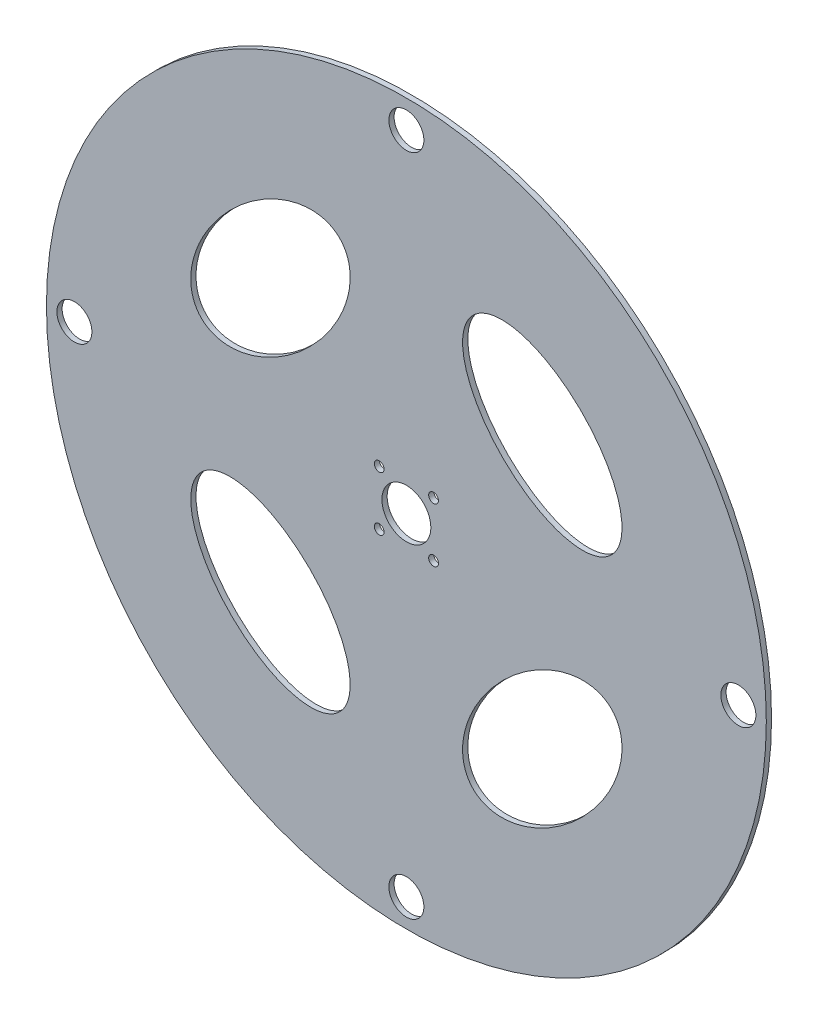
ISO-10303-21;
HEADER;
FILE_DESCRIPTION(('STEP AP214'),'2;1');
FILE_NAME('part.step','',(''),(''),'','','');
FILE_SCHEMA(('AUTOMOTIVE_DESIGN { 1 0 10303 214 1 1 1 1 }'));
ENDSEC;
DATA;
#1=APPLICATION_CONTEXT('core data for automotive mechanical design processes');
#2=APPLICATION_PROTOCOL_DEFINITION('international standard','automotive_design',2000,#1);
#3=PRODUCT_CONTEXT('',#1,'mechanical');
#4=PRODUCT('Part','Part','',(#3));
#5=PRODUCT_RELATED_PRODUCT_CATEGORY('part','',(#4));
#6=PRODUCT_DEFINITION_FORMATION('','',#4);
#7=PRODUCT_DEFINITION_CONTEXT('part definition',#1,'design');
#8=PRODUCT_DEFINITION('design','',#6,#7);
#9=PRODUCT_DEFINITION_SHAPE('','',#8);
#10=(LENGTH_UNIT() NAMED_UNIT(*) SI_UNIT(.MILLI.,.METRE.));
#11=(NAMED_UNIT(*) PLANE_ANGLE_UNIT() SI_UNIT($,.RADIAN.));
#12=(NAMED_UNIT(*) SI_UNIT($,.STERADIAN.) SOLID_ANGLE_UNIT());
#13=UNCERTAINTY_MEASURE_WITH_UNIT(LENGTH_MEASURE(1.E-05),#10,'distance_accuracy_value','');
#14=(GEOMETRIC_REPRESENTATION_CONTEXT(3) GLOBAL_UNCERTAINTY_ASSIGNED_CONTEXT((#13)) GLOBAL_UNIT_ASSIGNED_CONTEXT((#10,
#11,#12)) REPRESENTATION_CONTEXT('',''));
#15=CARTESIAN_POINT('',(0.,0.,0.));
#16=DIRECTION('',(0.,0.,1.));
#17=DIRECTION('',(1.,0.,0.));
#18=AXIS2_PLACEMENT_3D('',#15,#16,#17);
#19=CARTESIAN_POINT('',(0.,0.,1.5));
#20=DIRECTION('',(0.,0.,-1.));
#21=DIRECTION('',(-1.,0.,0.));
#22=AXIS2_PLACEMENT_3D('',#19,#20,#21);
#23=CYLINDRICAL_SURFACE('',#22,103.);
#24=CARTESIAN_POINT('',(0.,0.,1.5));
#25=DIRECTION('',(0.,0.,1.));
#26=DIRECTION('',(1.,0.,0.));
#27=AXIS2_PLACEMENT_3D('',#24,#25,#26);
#28=CIRCLE('',#27,103.);
#29=CARTESIAN_POINT('',(103.,0.,1.5));
#30=VERTEX_POINT('',#29);
#31=EDGE_CURVE('E10',#30,#30,#28,.T.);
#32=ORIENTED_EDGE('',*,*,#31,.F.);
#33=EDGE_LOOP('',(#32));
#34=FACE_BOUND('',#33,.T.);
#35=CARTESIAN_POINT('',(0.,0.,0.));
#36=DIRECTION('',(0.,0.,1.));
#37=DIRECTION('',(1.,0.,0.));
#38=AXIS2_PLACEMENT_3D('',#35,#36,#37);
#39=CIRCLE('',#38,103.);
#40=CARTESIAN_POINT('',(103.,0.,0.));
#41=VERTEX_POINT('',#40);
#42=EDGE_CURVE('E37',#41,#41,#39,.T.);
#43=ORIENTED_EDGE('',*,*,#42,.T.);
#44=EDGE_LOOP('',(#43));
#45=FACE_BOUND('',#44,.T.);
#46=ADVANCED_FACE('F40',(#34,#45),#23,.T.);
#47=CARTESIAN_POINT('',(0.,0.,1.5));
#48=DIRECTION('',(0.,0.,1.));
#49=DIRECTION('',(1.,0.,0.));
#50=AXIS2_PLACEMENT_3D('',#47,#48,#49);
#51=PLANE('',#50);
#52=CARTESIAN_POINT('',(95.,0.,1.5));
#53=DIRECTION('',(0.,0.,-1.));
#54=DIRECTION('',(-1.,0.,0.));
#55=AXIS2_PLACEMENT_3D('',#52,#53,#54);
#56=CIRCLE('',#55,5.01);
#57=CARTESIAN_POINT('',(89.99,0.,1.5));
#58=VERTEX_POINT('',#57);
#59=EDGE_CURVE('E87',#58,#58,#56,.T.);
#60=ORIENTED_EDGE('',*,*,#59,.T.);
#61=EDGE_LOOP('',(#60));
#62=FACE_BOUND('',#61,.T.);
#63=CARTESIAN_POINT('',(0.,95.,1.5));
#64=DIRECTION('',(0.,0.,-1.));
#65=DIRECTION('',(-1.,0.,0.));
#66=AXIS2_PLACEMENT_3D('',#63,#64,#65);
#67=CIRCLE('',#66,5.01);
#68=CARTESIAN_POINT('',(-5.01,95.,1.5));
#69=VERTEX_POINT('',#68);
#70=EDGE_CURVE('E288',#69,#69,#67,.T.);
#71=ORIENTED_EDGE('',*,*,#70,.T.);
#72=EDGE_LOOP('',(#71));
#73=FACE_BOUND('',#72,.T.);
#74=CARTESIAN_POINT('',(-95.,0.,1.5));
#75=DIRECTION('',(0.,0.,-1.));
#76=DIRECTION('',(-1.,0.,0.));
#77=AXIS2_PLACEMENT_3D('',#74,#75,#76);
#78=CIRCLE('',#77,5.01);
#79=CARTESIAN_POINT('',(-100.01,0.,1.5));
#80=VERTEX_POINT('',#79);
#81=EDGE_CURVE('E296',#80,#80,#78,.T.);
#82=ORIENTED_EDGE('',*,*,#81,.T.);
#83=EDGE_LOOP('',(#82));
#84=FACE_BOUND('',#83,.T.);
#85=CARTESIAN_POINT('',(0.,-95.,1.5));
#86=DIRECTION('',(0.,0.,-1.));
#87=DIRECTION('',(-1.,0.,0.));
#88=AXIS2_PLACEMENT_3D('',#85,#86,#87);
#89=CIRCLE('',#88,5.01);
#90=CARTESIAN_POINT('',(-5.01,-95.,1.5));
#91=VERTEX_POINT('',#90);
#92=EDGE_CURVE('E304',#91,#91,#89,.T.);
#93=ORIENTED_EDGE('',*,*,#92,.T.);
#94=EDGE_LOOP('',(#93));
#95=FACE_BOUND('',#94,.T.);
#96=CARTESIAN_POINT('',(7.77817459305194,-7.7781745930521,1.5));
#97=DIRECTION('',(0.,0.,1.));
#98=DIRECTION('',(1.,0.,0.));
#99=AXIS2_PLACEMENT_3D('',#96,#97,#98);
#100=CIRCLE('',#99,1.4);
#101=CARTESIAN_POINT('',(9.17817459305194,-7.7781745930521,1.5));
#102=VERTEX_POINT('',#101);
#103=EDGE_CURVE('E94',#102,#102,#100,.T.);
#104=ORIENTED_EDGE('',*,*,#103,.F.);
#105=EDGE_LOOP('',(#104));
#106=FACE_BOUND('',#105,.T.);
#107=CARTESIAN_POINT('',(7.77817459305208,7.77817459305197,1.5));
#108=DIRECTION('',(0.,0.,1.));
#109=DIRECTION('',(1.,0.,0.));
#110=AXIS2_PLACEMENT_3D('',#107,#108,#109);
#111=CIRCLE('',#110,1.4);
#112=CARTESIAN_POINT('',(9.17817459305208,7.77817459305197,1.5));
#113=VERTEX_POINT('',#112);
#114=EDGE_CURVE('E109',#113,#113,#111,.T.);
#115=ORIENTED_EDGE('',*,*,#114,.F.);
#116=EDGE_LOOP('',(#115));
#117=FACE_BOUND('',#116,.T.);
#118=CARTESIAN_POINT('',(-7.77817459305199,7.77817459305205,1.5));
#119=DIRECTION('',(0.,0.,1.));
#120=DIRECTION('',(1.,0.,0.));
#121=AXIS2_PLACEMENT_3D('',#118,#119,#120);
#122=CIRCLE('',#121,1.4);
#123=CARTESIAN_POINT('',(-6.378174593052,7.77817459305205,1.5));
#124=VERTEX_POINT('',#123);
#125=EDGE_CURVE('E101',#124,#124,#122,.T.);
#126=ORIENTED_EDGE('',*,*,#125,.F.);
#127=EDGE_LOOP('',(#126));
#128=FACE_BOUND('',#127,.T.);
#129=CARTESIAN_POINT('',(-7.77817459305202,-7.77817459305202,1.5));
#130=DIRECTION('',(0.,0.,1.));
#131=DIRECTION('',(1.,0.,0.));
#132=AXIS2_PLACEMENT_3D('',#129,#130,#131);
#133=CIRCLE('',#132,1.4);
#134=CARTESIAN_POINT('',(-6.37817459305202,-7.77817459305202,1.5));
#135=VERTEX_POINT('',#134);
#136=EDGE_CURVE('E118',#135,#135,#133,.T.);
#137=ORIENTED_EDGE('',*,*,#136,.F.);
#138=EDGE_LOOP('',(#137));
#139=FACE_BOUND('',#138,.T.);
#140=CARTESIAN_POINT('',(38.8908729652602,38.89087296526,1.5));
#141=DIRECTION('',(0.,0.,-1.));
#142=DIRECTION('',(0.707106781186545,-0.70710678118655,0.));
#143=AXIS2_PLACEMENT_3D('',#140,#141,#142);
#144=ELLIPSE('',#143,28.,16.);
#145=CARTESIAN_POINT('',(58.6898628384835,19.0918830920366,1.5));
#146=VERTEX_POINT('',#145);
#147=EDGE_CURVE('E55',#146,#146,#144,.T.);
#148=ORIENTED_EDGE('',*,*,#147,.T.);
#149=EDGE_LOOP('',(#148));
#150=FACE_BOUND('',#149,.T.);
#151=CARTESIAN_POINT('',(38.8908729652601,-38.8908729652601,1.5));
#152=DIRECTION('',(0.,0.,-1.));
#153=DIRECTION('',(-0.707106781186547,-0.707106781186548,0.));
#154=AXIS2_PLACEMENT_3D('',#151,#152,#153);
#155=ELLIPSE('',#154,28.,16.);
#156=CARTESIAN_POINT('',(19.0918830920368,-58.6898628384834,1.5));
#157=VERTEX_POINT('',#156);
#158=EDGE_CURVE('E140',#157,#157,#155,.T.);
#159=ORIENTED_EDGE('',*,*,#158,.T.);
#160=EDGE_LOOP('',(#159));
#161=FACE_BOUND('',#160,.T.);
#162=CARTESIAN_POINT('',(-38.8908729652605,-38.8908729652597,1.5));
#163=DIRECTION('',(0.,0.,-1.));
#164=DIRECTION('',(-0.70710678118654,0.707106781186555,0.));
#165=AXIS2_PLACEMENT_3D('',#162,#163,#164);
#166=ELLIPSE('',#165,28.,16.);
#167=CARTESIAN_POINT('',(-58.6898628384836,-19.0918830920362,1.5));
#168=VERTEX_POINT('',#167);
#169=EDGE_CURVE('E143',#168,#168,#166,.T.);
#170=ORIENTED_EDGE('',*,*,#169,.T.);
#171=EDGE_LOOP('',(#170));
#172=FACE_BOUND('',#171,.T.);
#173=CARTESIAN_POINT('',(-38.8908729652601,38.8908729652601,1.5));
#174=DIRECTION('',(0.,0.,-1.));
#175=DIRECTION('',(0.707106781186547,0.707106781186548,0.));
#176=AXIS2_PLACEMENT_3D('',#173,#174,#175);
#177=ELLIPSE('',#176,28.,16.);
#178=CARTESIAN_POINT('',(-19.0918830920368,58.6898628384834,1.5));
#179=VERTEX_POINT('',#178);
#180=EDGE_CURVE('E50',#179,#179,#177,.T.);
#181=ORIENTED_EDGE('',*,*,#180,.T.);
#182=EDGE_LOOP('',(#181));
#183=FACE_BOUND('',#182,.T.);
#184=ORIENTED_EDGE('',*,*,#31,.T.);
#185=EDGE_LOOP('',(#184));
#186=FACE_BOUND('',#185,.T.);
#187=CARTESIAN_POINT('',(0.,0.,1.5));
#188=DIRECTION('',(0.,0.,1.));
#189=DIRECTION('',(1.,0.,0.));
#190=AXIS2_PLACEMENT_3D('',#187,#188,#189);
#191=CIRCLE('',#190,7.);
#192=CARTESIAN_POINT('',(7.,0.,1.5));
#193=VERTEX_POINT('',#192);
#194=EDGE_CURVE('E88',#193,#193,#191,.T.);
#195=ORIENTED_EDGE('',*,*,#194,.F.);
#196=EDGE_LOOP('',(#195));
#197=FACE_BOUND('',#196,.T.);
#198=ADVANCED_FACE('F67',(#62,#73,#84,#95,#106,#117,#128,#139,#150,#161,#172,#183,#186,#197),
#51,.T.);
#199=CARTESIAN_POINT('',(0.,0.,0.));
#200=DIRECTION('',(0.,0.,1.));
#201=DIRECTION('',(1.,0.,0.));
#202=AXIS2_PLACEMENT_3D('',#199,#200,#201);
#203=PLANE('',#202);
#204=CARTESIAN_POINT('',(95.,0.,0.));
#205=DIRECTION('',(0.,0.,-1.));
#206=DIRECTION('',(-1.,0.,0.));
#207=AXIS2_PLACEMENT_3D('',#204,#205,#206);
#208=CIRCLE('',#207,5.01);
#209=CARTESIAN_POINT('',(89.99,0.,0.));
#210=VERTEX_POINT('',#209);
#211=EDGE_CURVE('E99',#210,#210,#208,.T.);
#212=ORIENTED_EDGE('',*,*,#211,.F.);
#213=EDGE_LOOP('',(#212));
#214=FACE_BOUND('',#213,.T.);
#215=CARTESIAN_POINT('',(0.,95.,0.));
#216=DIRECTION('',(0.,0.,-1.));
#217=DIRECTION('',(-1.,0.,0.));
#218=AXIS2_PLACEMENT_3D('',#215,#216,#217);
#219=CIRCLE('',#218,5.01);
#220=CARTESIAN_POINT('',(-5.01,95.,0.));
#221=VERTEX_POINT('',#220);
#222=EDGE_CURVE('E289',#221,#221,#219,.T.);
#223=ORIENTED_EDGE('',*,*,#222,.F.);
#224=EDGE_LOOP('',(#223));
#225=FACE_BOUND('',#224,.T.);
#226=CARTESIAN_POINT('',(-95.,0.,0.));
#227=DIRECTION('',(0.,0.,-1.));
#228=DIRECTION('',(-1.,0.,0.));
#229=AXIS2_PLACEMENT_3D('',#226,#227,#228);
#230=CIRCLE('',#229,5.01);
#231=CARTESIAN_POINT('',(-100.01,0.,0.));
#232=VERTEX_POINT('',#231);
#233=EDGE_CURVE('E293',#232,#232,#230,.T.);
#234=ORIENTED_EDGE('',*,*,#233,.F.);
#235=EDGE_LOOP('',(#234));
#236=FACE_BOUND('',#235,.T.);
#237=CARTESIAN_POINT('',(0.,-95.,0.));
#238=DIRECTION('',(0.,0.,-1.));
#239=DIRECTION('',(-1.,0.,0.));
#240=AXIS2_PLACEMENT_3D('',#237,#238,#239);
#241=CIRCLE('',#240,5.01);
#242=CARTESIAN_POINT('',(-5.01,-95.,0.));
#243=VERTEX_POINT('',#242);
#244=EDGE_CURVE('E297',#243,#243,#241,.T.);
#245=ORIENTED_EDGE('',*,*,#244,.F.);
#246=EDGE_LOOP('',(#245));
#247=FACE_BOUND('',#246,.T.);
#248=CARTESIAN_POINT('',(7.77817459305194,-7.7781745930521,0.));
#249=DIRECTION('',(0.,0.,1.));
#250=DIRECTION('',(1.,0.,0.));
#251=AXIS2_PLACEMENT_3D('',#248,#249,#250);
#252=CIRCLE('',#251,1.4);
#253=CARTESIAN_POINT('',(9.17817459305194,-7.7781745930521,0.));
#254=VERTEX_POINT('',#253);
#255=EDGE_CURVE('E111',#254,#254,#252,.T.);
#256=ORIENTED_EDGE('',*,*,#255,.T.);
#257=EDGE_LOOP('',(#256));
#258=FACE_BOUND('',#257,.T.);
#259=CARTESIAN_POINT('',(7.77817459305208,7.77817459305197,0.));
#260=DIRECTION('',(0.,0.,1.));
#261=DIRECTION('',(1.,0.,0.));
#262=AXIS2_PLACEMENT_3D('',#259,#260,#261);
#263=CIRCLE('',#262,1.4);
#264=CARTESIAN_POINT('',(9.17817459305208,7.77817459305197,0.));
#265=VERTEX_POINT('',#264);
#266=EDGE_CURVE('E107',#265,#265,#263,.T.);
#267=ORIENTED_EDGE('',*,*,#266,.T.);
#268=EDGE_LOOP('',(#267));
#269=FACE_BOUND('',#268,.T.);
#270=CARTESIAN_POINT('',(-7.77817459305199,7.77817459305205,0.));
#271=DIRECTION('',(0.,0.,1.));
#272=DIRECTION('',(1.,0.,0.));
#273=AXIS2_PLACEMENT_3D('',#270,#271,#272);
#274=CIRCLE('',#273,1.4);
#275=CARTESIAN_POINT('',(-6.378174593052,7.77817459305205,0.));
#276=VERTEX_POINT('',#275);
#277=EDGE_CURVE('E97',#276,#276,#274,.T.);
#278=ORIENTED_EDGE('',*,*,#277,.T.);
#279=EDGE_LOOP('',(#278));
#280=FACE_BOUND('',#279,.T.);
#281=CARTESIAN_POINT('',(-7.77817459305202,-7.77817459305202,0.));
#282=DIRECTION('',(0.,0.,1.));
#283=DIRECTION('',(1.,0.,0.));
#284=AXIS2_PLACEMENT_3D('',#281,#282,#283);
#285=CIRCLE('',#284,1.4);
#286=CARTESIAN_POINT('',(-6.37817459305202,-7.77817459305202,0.));
#287=VERTEX_POINT('',#286);
#288=EDGE_CURVE('E105',#287,#287,#285,.T.);
#289=ORIENTED_EDGE('',*,*,#288,.T.);
#290=EDGE_LOOP('',(#289));
#291=FACE_BOUND('',#290,.T.);
#292=CARTESIAN_POINT('',(38.8908729652602,38.89087296526,0.));
#293=DIRECTION('',(0.,0.,-1.));
#294=DIRECTION('',(0.707106781186545,-0.70710678118655,0.));
#295=AXIS2_PLACEMENT_3D('',#292,#293,#294);
#296=ELLIPSE('',#295,28.,16.);
#297=CARTESIAN_POINT('',(58.6898628384835,19.0918830920366,0.));
#298=VERTEX_POINT('',#297);
#299=EDGE_CURVE('E126',#298,#298,#296,.T.);
#300=ORIENTED_EDGE('',*,*,#299,.F.);
#301=EDGE_LOOP('',(#300));
#302=FACE_BOUND('',#301,.T.);
#303=CARTESIAN_POINT('',(38.8908729652601,-38.8908729652601,0.));
#304=DIRECTION('',(0.,0.,-1.));
#305=DIRECTION('',(-0.707106781186547,-0.707106781186548,0.));
#306=AXIS2_PLACEMENT_3D('',#303,#304,#305);
#307=ELLIPSE('',#306,28.,16.);
#308=CARTESIAN_POINT('',(19.0918830920368,-58.6898628384834,0.));
#309=VERTEX_POINT('',#308);
#310=EDGE_CURVE('E142',#309,#309,#307,.T.);
#311=ORIENTED_EDGE('',*,*,#310,.F.);
#312=EDGE_LOOP('',(#311));
#313=FACE_BOUND('',#312,.T.);
#314=CARTESIAN_POINT('',(-38.8908729652605,-38.8908729652597,0.));
#315=DIRECTION('',(0.,0.,-1.));
#316=DIRECTION('',(-0.70710678118654,0.707106781186555,0.));
#317=AXIS2_PLACEMENT_3D('',#314,#315,#316);
#318=ELLIPSE('',#317,28.,16.);
#319=CARTESIAN_POINT('',(-58.6898628384836,-19.0918830920362,0.));
#320=VERTEX_POINT('',#319);
#321=EDGE_CURVE('E57',#320,#320,#318,.T.);
#322=ORIENTED_EDGE('',*,*,#321,.F.);
#323=EDGE_LOOP('',(#322));
#324=FACE_BOUND('',#323,.T.);
#325=CARTESIAN_POINT('',(-38.8908729652601,38.8908729652601,0.));
#326=DIRECTION('',(0.,0.,-1.));
#327=DIRECTION('',(0.707106781186547,0.707106781186548,0.));
#328=AXIS2_PLACEMENT_3D('',#325,#326,#327);
#329=ELLIPSE('',#328,28.,16.);
#330=CARTESIAN_POINT('',(-19.0918830920368,58.6898628384834,0.));
#331=VERTEX_POINT('',#330);
#332=EDGE_CURVE('E47',#331,#331,#329,.T.);
#333=ORIENTED_EDGE('',*,*,#332,.F.);
#334=EDGE_LOOP('',(#333));
#335=FACE_BOUND('',#334,.T.);
#336=ORIENTED_EDGE('',*,*,#42,.F.);
#337=EDGE_LOOP('',(#336));
#338=FACE_BOUND('',#337,.T.);
#339=CARTESIAN_POINT('',(0.,0.,0.));
#340=DIRECTION('',(0.,0.,1.));
#341=DIRECTION('',(1.,0.,0.));
#342=AXIS2_PLACEMENT_3D('',#339,#340,#341);
#343=CIRCLE('',#342,7.);
#344=CARTESIAN_POINT('',(7.,0.,0.));
#345=VERTEX_POINT('',#344);
#346=EDGE_CURVE('E86',#345,#345,#343,.T.);
#347=ORIENTED_EDGE('',*,*,#346,.T.);
#348=EDGE_LOOP('',(#347));
#349=FACE_BOUND('',#348,.T.);
#350=ADVANCED_FACE('F63',(#214,#225,#236,#247,#258,#269,#280,#291,#302,#313,#324,#335,#338,
#349),#203,.F.);
#351=DIRECTION('',(0.,0.,-1.));
#352=VECTOR('',#351,1.);
#353=SURFACE_OF_LINEAR_EXTRUSION('',#177,#352);
#354=ORIENTED_EDGE('',*,*,#180,.F.);
#355=EDGE_LOOP('',(#354));
#356=FACE_BOUND('',#355,.T.);
#357=ORIENTED_EDGE('',*,*,#332,.T.);
#358=EDGE_LOOP('',(#357));
#359=FACE_BOUND('',#358,.T.);
#360=ADVANCED_FACE('F56',(#356,#359),#353,.F.);
#361=DIRECTION('',(0.,0.,-1.));
#362=VECTOR('',#361,1.);
#363=SURFACE_OF_LINEAR_EXTRUSION('',#166,#362);
#364=ORIENTED_EDGE('',*,*,#169,.F.);
#365=EDGE_LOOP('',(#364));
#366=FACE_BOUND('',#365,.T.);
#367=ORIENTED_EDGE('',*,*,#321,.T.);
#368=EDGE_LOOP('',(#367));
#369=FACE_BOUND('',#368,.T.);
#370=ADVANCED_FACE('F65',(#366,#369),#363,.F.);
#371=DIRECTION('',(0.,0.,-1.));
#372=VECTOR('',#371,1.);
#373=SURFACE_OF_LINEAR_EXTRUSION('',#155,#372);
#374=ORIENTED_EDGE('',*,*,#158,.F.);
#375=EDGE_LOOP('',(#374));
#376=FACE_BOUND('',#375,.T.);
#377=ORIENTED_EDGE('',*,*,#310,.T.);
#378=EDGE_LOOP('',(#377));
#379=FACE_BOUND('',#378,.T.);
#380=ADVANCED_FACE('F134',(#376,#379),#373,.F.);
#381=DIRECTION('',(0.,0.,-1.));
#382=VECTOR('',#381,1.);
#383=SURFACE_OF_LINEAR_EXTRUSION('',#144,#382);
#384=ORIENTED_EDGE('',*,*,#147,.F.);
#385=EDGE_LOOP('',(#384));
#386=FACE_BOUND('',#385,.T.);
#387=ORIENTED_EDGE('',*,*,#299,.T.);
#388=EDGE_LOOP('',(#387));
#389=FACE_BOUND('',#388,.T.);
#390=ADVANCED_FACE('F128',(#386,#389),#383,.F.);
#391=CARTESIAN_POINT('',(-7.77817459305202,-7.77817459305202,1.5));
#392=DIRECTION('',(0.,0.,-1.));
#393=DIRECTION('',(-1.,0.,0.));
#394=AXIS2_PLACEMENT_3D('',#391,#392,#393);
#395=CYLINDRICAL_SURFACE('',#394,1.4);
#396=ORIENTED_EDGE('',*,*,#136,.T.);
#397=EDGE_LOOP('',(#396));
#398=FACE_BOUND('',#397,.T.);
#399=ORIENTED_EDGE('',*,*,#288,.F.);
#400=EDGE_LOOP('',(#399));
#401=FACE_BOUND('',#400,.T.);
#402=ADVANCED_FACE('F135',(#398,#401),#395,.F.);
#403=CARTESIAN_POINT('',(-7.77817459305199,7.77817459305205,1.5));
#404=DIRECTION('',(0.,0.,-1.));
#405=DIRECTION('',(-1.,0.,0.));
#406=AXIS2_PLACEMENT_3D('',#403,#404,#405);
#407=CYLINDRICAL_SURFACE('',#406,1.4);
#408=ORIENTED_EDGE('',*,*,#125,.T.);
#409=EDGE_LOOP('',(#408));
#410=FACE_BOUND('',#409,.T.);
#411=ORIENTED_EDGE('',*,*,#277,.F.);
#412=EDGE_LOOP('',(#411));
#413=FACE_BOUND('',#412,.T.);
#414=ADVANCED_FACE('F176',(#410,#413),#407,.F.);
#415=CARTESIAN_POINT('',(7.77817459305208,7.77817459305197,1.5));
#416=DIRECTION('',(0.,0.,-1.));
#417=DIRECTION('',(-1.,0.,0.));
#418=AXIS2_PLACEMENT_3D('',#415,#416,#417);
#419=CYLINDRICAL_SURFACE('',#418,1.4);
#420=ORIENTED_EDGE('',*,*,#114,.T.);
#421=EDGE_LOOP('',(#420));
#422=FACE_BOUND('',#421,.T.);
#423=ORIENTED_EDGE('',*,*,#266,.F.);
#424=EDGE_LOOP('',(#423));
#425=FACE_BOUND('',#424,.T.);
#426=ADVANCED_FACE('F190',(#422,#425),#419,.F.);
#427=CARTESIAN_POINT('',(7.77817459305194,-7.7781745930521,1.5));
#428=DIRECTION('',(0.,0.,-1.));
#429=DIRECTION('',(-1.,0.,0.));
#430=AXIS2_PLACEMENT_3D('',#427,#428,#429);
#431=CYLINDRICAL_SURFACE('',#430,1.4);
#432=ORIENTED_EDGE('',*,*,#103,.T.);
#433=EDGE_LOOP('',(#432));
#434=FACE_BOUND('',#433,.T.);
#435=ORIENTED_EDGE('',*,*,#255,.F.);
#436=EDGE_LOOP('',(#435));
#437=FACE_BOUND('',#436,.T.);
#438=ADVANCED_FACE('F196',(#434,#437),#431,.F.);
#439=CARTESIAN_POINT('',(0.,0.,1.5));
#440=DIRECTION('',(0.,0.,-1.));
#441=DIRECTION('',(-1.,0.,0.));
#442=AXIS2_PLACEMENT_3D('',#439,#440,#441);
#443=CYLINDRICAL_SURFACE('',#442,7.);
#444=ORIENTED_EDGE('',*,*,#194,.T.);
#445=EDGE_LOOP('',(#444));
#446=FACE_BOUND('',#445,.T.);
#447=ORIENTED_EDGE('',*,*,#346,.F.);
#448=EDGE_LOOP('',(#447));
#449=FACE_BOUND('',#448,.T.);
#450=ADVANCED_FACE('F204',(#446,#449),#443,.F.);
#451=CARTESIAN_POINT('',(0.,-95.,1.5));
#452=DIRECTION('',(0.,0.,-1.));
#453=DIRECTION('',(-1.,0.,0.));
#454=AXIS2_PLACEMENT_3D('',#451,#452,#453);
#455=CYLINDRICAL_SURFACE('',#454,5.01);
#456=ORIENTED_EDGE('',*,*,#92,.F.);
#457=EDGE_LOOP('',(#456));
#458=FACE_BOUND('',#457,.T.);
#459=ORIENTED_EDGE('',*,*,#244,.T.);
#460=EDGE_LOOP('',(#459));
#461=FACE_BOUND('',#460,.T.);
#462=ADVANCED_FACE('F215',(#458,#461),#455,.F.);
#463=CARTESIAN_POINT('',(-95.,0.,1.5));
#464=DIRECTION('',(0.,0.,-1.));
#465=DIRECTION('',(-1.,0.,0.));
#466=AXIS2_PLACEMENT_3D('',#463,#464,#465);
#467=CYLINDRICAL_SURFACE('',#466,5.01);
#468=ORIENTED_EDGE('',*,*,#81,.F.);
#469=EDGE_LOOP('',(#468));
#470=FACE_BOUND('',#469,.T.);
#471=ORIENTED_EDGE('',*,*,#233,.T.);
#472=EDGE_LOOP('',(#471));
#473=FACE_BOUND('',#472,.T.);
#474=ADVANCED_FACE('F248',(#470,#473),#467,.F.);
#475=CARTESIAN_POINT('',(0.,95.,1.5));
#476=DIRECTION('',(0.,0.,-1.));
#477=DIRECTION('',(-1.,0.,0.));
#478=AXIS2_PLACEMENT_3D('',#475,#476,#477);
#479=CYLINDRICAL_SURFACE('',#478,5.01);
#480=ORIENTED_EDGE('',*,*,#70,.F.);
#481=EDGE_LOOP('',(#480));
#482=FACE_BOUND('',#481,.T.);
#483=ORIENTED_EDGE('',*,*,#222,.T.);
#484=EDGE_LOOP('',(#483));
#485=FACE_BOUND('',#484,.T.);
#486=ADVANCED_FACE('F256',(#482,#485),#479,.F.);
#487=CARTESIAN_POINT('',(95.,0.,1.5));
#488=DIRECTION('',(0.,0.,-1.));
#489=DIRECTION('',(-1.,0.,0.));
#490=AXIS2_PLACEMENT_3D('',#487,#488,#489);
#491=CYLINDRICAL_SURFACE('',#490,5.01);
#492=ORIENTED_EDGE('',*,*,#59,.F.);
#493=EDGE_LOOP('',(#492));
#494=FACE_BOUND('',#493,.T.);
#495=ORIENTED_EDGE('',*,*,#211,.T.);
#496=EDGE_LOOP('',(#495));
#497=FACE_BOUND('',#496,.T.);
#498=ADVANCED_FACE('F270',(#494,#497),#491,.F.);
#499=CLOSED_SHELL('',(#46,#198,#350,#360,#370,#380,#390,#402,#414,#426,#438,#450,#462,#474,#486,#498));
#500=MANIFOLD_SOLID_BREP('B2',#499);
#501=ADVANCED_BREP_SHAPE_REPRESENTATION('',(#18,#500),#14);
#502=SHAPE_DEFINITION_REPRESENTATION(#9,#501);
ENDSEC;
END-ISO-10303-21;
